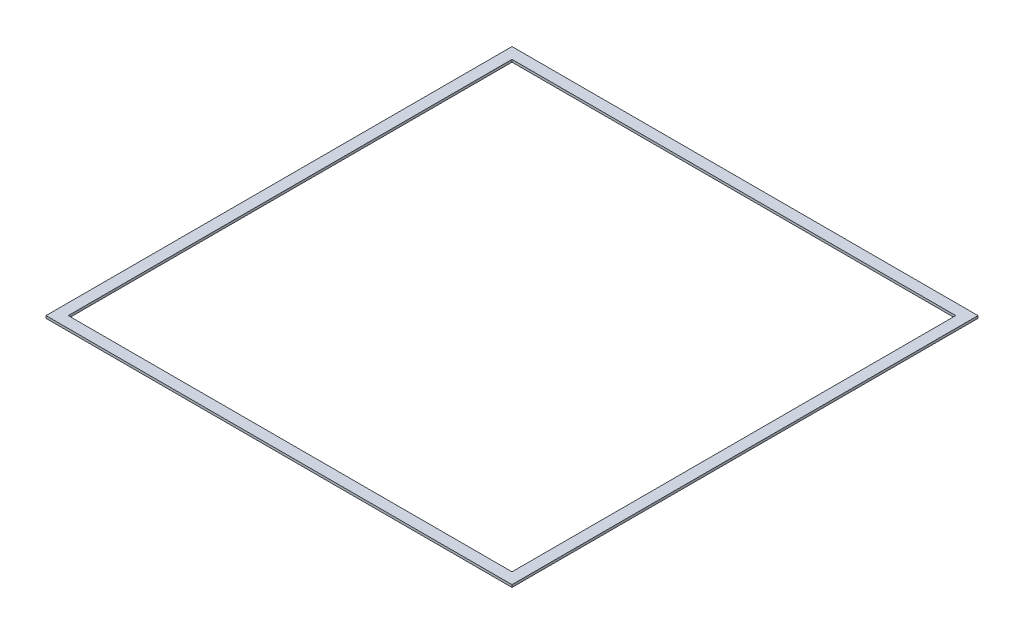
ISO-10303-21;
HEADER;
FILE_DESCRIPTION(('STEP AP214'),'2;1');
FILE_NAME('part.step','',(''),(''),'','','');
FILE_SCHEMA(('AUTOMOTIVE_DESIGN { 1 0 10303 214 1 1 1 1 }'));
ENDSEC;
DATA;
#1=APPLICATION_CONTEXT('core data for automotive mechanical design processes');
#2=APPLICATION_PROTOCOL_DEFINITION('international standard','automotive_design',2000,#1);
#3=PRODUCT_CONTEXT('',#1,'mechanical');
#4=PRODUCT('Part','Part','',(#3));
#5=PRODUCT_RELATED_PRODUCT_CATEGORY('part','',(#4));
#6=PRODUCT_DEFINITION_FORMATION('','',#4);
#7=PRODUCT_DEFINITION_CONTEXT('part definition',#1,'design');
#8=PRODUCT_DEFINITION('design','',#6,#7);
#9=PRODUCT_DEFINITION_SHAPE('','',#8);
#10=(LENGTH_UNIT() NAMED_UNIT(*) SI_UNIT(.MILLI.,.METRE.));
#11=(NAMED_UNIT(*) PLANE_ANGLE_UNIT() SI_UNIT($,.RADIAN.));
#12=(NAMED_UNIT(*) SI_UNIT($,.STERADIAN.) SOLID_ANGLE_UNIT());
#13=UNCERTAINTY_MEASURE_WITH_UNIT(LENGTH_MEASURE(1.E-05),#10,'distance_accuracy_value','');
#14=(GEOMETRIC_REPRESENTATION_CONTEXT(3) GLOBAL_UNCERTAINTY_ASSIGNED_CONTEXT((#13)) GLOBAL_UNIT_ASSIGNED_CONTEXT((#10,
#11,#12)) REPRESENTATION_CONTEXT('',''));
#15=CARTESIAN_POINT('',(0.,0.,0.));
#16=DIRECTION('',(0.,0.,1.));
#17=DIRECTION('',(1.,0.,0.));
#18=AXIS2_PLACEMENT_3D('',#15,#16,#17);
#19=CARTESIAN_POINT('',(0.,1.1,0.));
#20=DIRECTION('',(0.,1.,0.));
#21=DIRECTION('',(0.,0.,1.));
#22=AXIS2_PLACEMENT_3D('',#19,#20,#21);
#23=PLANE('',#22);
#24=DIRECTION('',(1.,0.,0.));
#25=VECTOR('',#24,1.);
#26=CARTESIAN_POINT('',(-209.5,1.1,209.5));
#27=LINE('',#26,#25);
#28=CARTESIAN_POINT('',(-209.5,1.1,209.5));
#29=VERTEX_POINT('',#28);
#30=CARTESIAN_POINT('',(209.5,1.1,209.5));
#31=VERTEX_POINT('',#30);
#32=EDGE_CURVE('E153',#29,#31,#27,.T.);
#33=ORIENTED_EDGE('',*,*,#32,.T.);
#34=DIRECTION('',(0.,0.,-1.));
#35=VECTOR('',#34,1.);
#36=CARTESIAN_POINT('',(209.5,1.1,209.5));
#37=LINE('',#36,#35);
#38=CARTESIAN_POINT('',(209.5,1.1,-209.5));
#39=VERTEX_POINT('',#38);
#40=EDGE_CURVE('E157',#31,#39,#37,.T.);
#41=ORIENTED_EDGE('',*,*,#40,.T.);
#42=DIRECTION('',(-1.,0.,0.));
#43=VECTOR('',#42,1.);
#44=CARTESIAN_POINT('',(-209.5,1.1,-209.5));
#45=LINE('',#44,#43);
#46=CARTESIAN_POINT('',(-209.5,1.1,-209.5));
#47=VERTEX_POINT('',#46);
#48=EDGE_CURVE('E161',#39,#47,#45,.T.);
#49=ORIENTED_EDGE('',*,*,#48,.T.);
#50=DIRECTION('',(0.,0.,1.));
#51=VECTOR('',#50,1.);
#52=CARTESIAN_POINT('',(-209.5,1.1,209.5));
#53=LINE('',#52,#51);
#54=EDGE_CURVE('E164',#47,#29,#53,.T.);
#55=ORIENTED_EDGE('',*,*,#54,.T.);
#56=EDGE_LOOP('',(#33,#41,#49,#55));
#57=FACE_BOUND('',#56,.T.);
#58=DIRECTION('',(-1.,0.,0.));
#59=VECTOR('',#58,1.);
#60=CARTESIAN_POINT('',(-199.5,1.1,-199.5));
#61=LINE('',#60,#59);
#62=CARTESIAN_POINT('',(199.5,1.1,-199.5));
#63=VERTEX_POINT('',#62);
#64=CARTESIAN_POINT('',(-199.5,1.1,-199.5));
#65=VERTEX_POINT('',#64);
#66=EDGE_CURVE('E114',#63,#65,#61,.T.);
#67=ORIENTED_EDGE('',*,*,#66,.F.);
#68=DIRECTION('',(0.,0.,-1.));
#69=VECTOR('',#68,1.);
#70=CARTESIAN_POINT('',(199.5,1.1,199.5));
#71=LINE('',#70,#69);
#72=CARTESIAN_POINT('',(199.5,1.1,199.5));
#73=VERTEX_POINT('',#72);
#74=EDGE_CURVE('E105',#73,#63,#71,.T.);
#75=ORIENTED_EDGE('',*,*,#74,.F.);
#76=DIRECTION('',(1.,0.,0.));
#77=VECTOR('',#76,1.);
#78=CARTESIAN_POINT('',(-199.5,1.1,199.5));
#79=LINE('',#78,#77);
#80=CARTESIAN_POINT('',(-199.5,1.1,199.5));
#81=VERTEX_POINT('',#80);
#82=EDGE_CURVE('E131',#81,#73,#79,.T.);
#83=ORIENTED_EDGE('',*,*,#82,.F.);
#84=DIRECTION('',(0.,0.,1.));
#85=VECTOR('',#84,1.);
#86=CARTESIAN_POINT('',(-199.5,1.1,199.5));
#87=LINE('',#86,#85);
#88=EDGE_CURVE('E127',#65,#81,#87,.T.);
#89=ORIENTED_EDGE('',*,*,#88,.F.);
#90=EDGE_LOOP('',(#67,#75,#83,#89));
#91=FACE_BOUND('',#90,.T.);
#92=ADVANCED_FACE('F39',(#57,#91),#23,.T.);
#93=CARTESIAN_POINT('',(0.,-1.1,0.));
#94=DIRECTION('',(0.,1.,0.));
#95=DIRECTION('',(0.,0.,1.));
#96=AXIS2_PLACEMENT_3D('',#93,#94,#95);
#97=PLANE('',#96);
#98=DIRECTION('',(1.,0.,0.));
#99=VECTOR('',#98,1.);
#100=CARTESIAN_POINT('',(-209.5,-1.1,209.5));
#101=LINE('',#100,#99);
#102=CARTESIAN_POINT('',(-209.5,-1.1,209.5));
#103=VERTEX_POINT('',#102);
#104=CARTESIAN_POINT('',(209.5,-1.1,209.5));
#105=VERTEX_POINT('',#104);
#106=EDGE_CURVE('E123',#103,#105,#101,.T.);
#107=ORIENTED_EDGE('',*,*,#106,.F.);
#108=DIRECTION('',(0.,0.,1.));
#109=VECTOR('',#108,1.);
#110=CARTESIAN_POINT('',(-209.5,-1.1,209.5));
#111=LINE('',#110,#109);
#112=CARTESIAN_POINT('',(-209.5,-1.1,-209.5));
#113=VERTEX_POINT('',#112);
#114=EDGE_CURVE('E158',#113,#103,#111,.T.);
#115=ORIENTED_EDGE('',*,*,#114,.F.);
#116=DIRECTION('',(-1.,0.,0.));
#117=VECTOR('',#116,1.);
#118=CARTESIAN_POINT('',(-209.5,-1.1,-209.5));
#119=LINE('',#118,#117);
#120=CARTESIAN_POINT('',(209.5,-1.1,-209.5));
#121=VERTEX_POINT('',#120);
#122=EDGE_CURVE('E174',#121,#113,#119,.T.);
#123=ORIENTED_EDGE('',*,*,#122,.F.);
#124=DIRECTION('',(0.,0.,-1.));
#125=VECTOR('',#124,1.);
#126=CARTESIAN_POINT('',(209.5,-1.1,209.5));
#127=LINE('',#126,#125);
#128=EDGE_CURVE('E171',#105,#121,#127,.T.);
#129=ORIENTED_EDGE('',*,*,#128,.F.);
#130=EDGE_LOOP('',(#107,#115,#123,#129));
#131=FACE_BOUND('',#130,.T.);
#132=DIRECTION('',(0.,0.,-1.));
#133=VECTOR('',#132,1.);
#134=CARTESIAN_POINT('',(199.5,-1.1,199.5));
#135=LINE('',#134,#133);
#136=CARTESIAN_POINT('',(199.5,-1.1,199.5));
#137=VERTEX_POINT('',#136);
#138=CARTESIAN_POINT('',(199.5,-1.1,-199.5));
#139=VERTEX_POINT('',#138);
#140=EDGE_CURVE('E63',#137,#139,#135,.T.);
#141=ORIENTED_EDGE('',*,*,#140,.T.);
#142=DIRECTION('',(-1.,0.,0.));
#143=VECTOR('',#142,1.);
#144=CARTESIAN_POINT('',(-199.5,-1.1,-199.5));
#145=LINE('',#144,#143);
#146=CARTESIAN_POINT('',(-199.5,-1.1,-199.5));
#147=VERTEX_POINT('',#146);
#148=EDGE_CURVE('E121',#139,#147,#145,.T.);
#149=ORIENTED_EDGE('',*,*,#148,.T.);
#150=DIRECTION('',(0.,0.,1.));
#151=VECTOR('',#150,1.);
#152=CARTESIAN_POINT('',(-199.5,-1.1,199.5));
#153=LINE('',#152,#151);
#154=CARTESIAN_POINT('',(-199.5,-1.1,199.5));
#155=VERTEX_POINT('',#154);
#156=EDGE_CURVE('E140',#147,#155,#153,.T.);
#157=ORIENTED_EDGE('',*,*,#156,.T.);
#158=DIRECTION('',(1.,0.,0.));
#159=VECTOR('',#158,1.);
#160=CARTESIAN_POINT('',(-199.5,-1.1,199.5));
#161=LINE('',#160,#159);
#162=EDGE_CURVE('E115',#155,#137,#161,.T.);
#163=ORIENTED_EDGE('',*,*,#162,.T.);
#164=EDGE_LOOP('',(#141,#149,#157,#163));
#165=FACE_BOUND('',#164,.T.);
#166=ADVANCED_FACE('F197',(#131,#165),#97,.F.);
#167=CARTESIAN_POINT('',(-209.5,1.1,209.5));
#168=DIRECTION('',(0.,0.,-1.));
#169=DIRECTION('',(-1.,0.,0.));
#170=AXIS2_PLACEMENT_3D('',#167,#168,#169);
#171=PLANE('',#170);
#172=ORIENTED_EDGE('',*,*,#106,.T.);
#173=DIRECTION('',(0.,-1.,0.));
#174=VECTOR('',#173,1.);
#175=CARTESIAN_POINT('',(209.5,1.1,209.5));
#176=LINE('',#175,#174);
#177=EDGE_CURVE('E11',#31,#105,#176,.T.);
#178=ORIENTED_EDGE('',*,*,#177,.F.);
#179=ORIENTED_EDGE('',*,*,#32,.F.);
#180=DIRECTION('',(0.,-1.,0.));
#181=VECTOR('',#180,1.);
#182=CARTESIAN_POINT('',(-209.5,1.1,209.5));
#183=LINE('',#182,#181);
#184=EDGE_CURVE('E167',#29,#103,#183,.T.);
#185=ORIENTED_EDGE('',*,*,#184,.T.);
#186=EDGE_LOOP('',(#172,#178,#179,#185));
#187=FACE_BOUND('',#186,.T.);
#188=ADVANCED_FACE('F41',(#187),#171,.F.);
#189=CARTESIAN_POINT('',(209.5,1.1,209.5));
#190=DIRECTION('',(-1.,0.,0.));
#191=DIRECTION('',(0.,0.,1.));
#192=AXIS2_PLACEMENT_3D('',#189,#190,#191);
#193=PLANE('',#192);
#194=ORIENTED_EDGE('',*,*,#128,.T.);
#195=DIRECTION('',(0.,-1.,0.));
#196=VECTOR('',#195,1.);
#197=CARTESIAN_POINT('',(209.5,1.1,-209.5));
#198=LINE('',#197,#196);
#199=EDGE_CURVE('E48',#39,#121,#198,.T.);
#200=ORIENTED_EDGE('',*,*,#199,.F.);
#201=ORIENTED_EDGE('',*,*,#40,.F.);
#202=ORIENTED_EDGE('',*,*,#177,.T.);
#203=EDGE_LOOP('',(#194,#200,#201,#202));
#204=FACE_BOUND('',#203,.T.);
#205=ADVANCED_FACE('F207',(#204),#193,.F.);
#206=CARTESIAN_POINT('',(-209.5,1.1,-209.5));
#207=DIRECTION('',(0.,0.,1.));
#208=DIRECTION('',(1.,0.,0.));
#209=AXIS2_PLACEMENT_3D('',#206,#207,#208);
#210=PLANE('',#209);
#211=ORIENTED_EDGE('',*,*,#122,.T.);
#212=DIRECTION('',(0.,-1.,0.));
#213=VECTOR('',#212,1.);
#214=CARTESIAN_POINT('',(-209.5,1.1,-209.5));
#215=LINE('',#214,#213);
#216=EDGE_CURVE('E182',#47,#113,#215,.T.);
#217=ORIENTED_EDGE('',*,*,#216,.F.);
#218=ORIENTED_EDGE('',*,*,#48,.F.);
#219=ORIENTED_EDGE('',*,*,#199,.T.);
#220=EDGE_LOOP('',(#211,#217,#218,#219));
#221=FACE_BOUND('',#220,.T.);
#222=ADVANCED_FACE('F191',(#221),#210,.F.);
#223=CARTESIAN_POINT('',(-209.5,1.1,209.5));
#224=DIRECTION('',(1.,0.,0.));
#225=DIRECTION('',(0.,0.,-1.));
#226=AXIS2_PLACEMENT_3D('',#223,#224,#225);
#227=PLANE('',#226);
#228=ORIENTED_EDGE('',*,*,#114,.T.);
#229=ORIENTED_EDGE('',*,*,#184,.F.);
#230=ORIENTED_EDGE('',*,*,#54,.F.);
#231=ORIENTED_EDGE('',*,*,#216,.T.);
#232=EDGE_LOOP('',(#228,#229,#230,#231));
#233=FACE_BOUND('',#232,.T.);
#234=ADVANCED_FACE('F201',(#233),#227,.F.);
#235=CARTESIAN_POINT('',(199.5,1.1,199.5));
#236=DIRECTION('',(-1.,0.,0.));
#237=DIRECTION('',(0.,0.,1.));
#238=AXIS2_PLACEMENT_3D('',#235,#236,#237);
#239=PLANE('',#238);
#240=ORIENTED_EDGE('',*,*,#140,.F.);
#241=DIRECTION('',(0.,-1.,0.));
#242=VECTOR('',#241,1.);
#243=CARTESIAN_POINT('',(199.5,1.1,199.5));
#244=LINE('',#243,#242);
#245=EDGE_CURVE('E109',#73,#137,#244,.T.);
#246=ORIENTED_EDGE('',*,*,#245,.F.);
#247=ORIENTED_EDGE('',*,*,#74,.T.);
#248=DIRECTION('',(0.,-1.,0.));
#249=VECTOR('',#248,1.);
#250=CARTESIAN_POINT('',(199.5,1.1,-199.5));
#251=LINE('',#250,#249);
#252=EDGE_CURVE('E108',#63,#139,#251,.T.);
#253=ORIENTED_EDGE('',*,*,#252,.T.);
#254=EDGE_LOOP('',(#240,#246,#247,#253));
#255=FACE_BOUND('',#254,.T.);
#256=ADVANCED_FACE('F107',(#255),#239,.T.);
#257=CARTESIAN_POINT('',(-199.5,1.1,-199.5));
#258=DIRECTION('',(0.,0.,1.));
#259=DIRECTION('',(1.,0.,0.));
#260=AXIS2_PLACEMENT_3D('',#257,#258,#259);
#261=PLANE('',#260);
#262=ORIENTED_EDGE('',*,*,#148,.F.);
#263=ORIENTED_EDGE('',*,*,#252,.F.);
#264=ORIENTED_EDGE('',*,*,#66,.T.);
#265=DIRECTION('',(0.,-1.,0.));
#266=VECTOR('',#265,1.);
#267=CARTESIAN_POINT('',(-199.5,1.1,-199.5));
#268=LINE('',#267,#266);
#269=EDGE_CURVE('E124',#65,#147,#268,.T.);
#270=ORIENTED_EDGE('',*,*,#269,.T.);
#271=EDGE_LOOP('',(#262,#263,#264,#270));
#272=FACE_BOUND('',#271,.T.);
#273=ADVANCED_FACE('F118',(#272),#261,.T.);
#274=CARTESIAN_POINT('',(-199.5,1.1,199.5));
#275=DIRECTION('',(1.,0.,0.));
#276=DIRECTION('',(0.,0.,-1.));
#277=AXIS2_PLACEMENT_3D('',#274,#275,#276);
#278=PLANE('',#277);
#279=ORIENTED_EDGE('',*,*,#156,.F.);
#280=ORIENTED_EDGE('',*,*,#269,.F.);
#281=ORIENTED_EDGE('',*,*,#88,.T.);
#282=DIRECTION('',(0.,-1.,0.));
#283=VECTOR('',#282,1.);
#284=CARTESIAN_POINT('',(-199.5,1.1,199.5));
#285=LINE('',#284,#283);
#286=EDGE_CURVE('E55',#81,#155,#285,.T.);
#287=ORIENTED_EDGE('',*,*,#286,.T.);
#288=EDGE_LOOP('',(#279,#280,#281,#287));
#289=FACE_BOUND('',#288,.T.);
#290=ADVANCED_FACE('F230',(#289),#278,.T.);
#291=CARTESIAN_POINT('',(-199.5,1.1,199.5));
#292=DIRECTION('',(0.,0.,-1.));
#293=DIRECTION('',(-1.,0.,0.));
#294=AXIS2_PLACEMENT_3D('',#291,#292,#293);
#295=PLANE('',#294);
#296=ORIENTED_EDGE('',*,*,#162,.F.);
#297=ORIENTED_EDGE('',*,*,#286,.F.);
#298=ORIENTED_EDGE('',*,*,#82,.T.);
#299=ORIENTED_EDGE('',*,*,#245,.T.);
#300=EDGE_LOOP('',(#296,#297,#298,#299));
#301=FACE_BOUND('',#300,.T.);
#302=ADVANCED_FACE('F234',(#301),#295,.T.);
#303=CLOSED_SHELL('',(#92,#166,#188,#205,#222,#234,#256,#273,#290,#302));
#304=MANIFOLD_SOLID_BREP('B2',#303);
#305=ADVANCED_BREP_SHAPE_REPRESENTATION('',(#18,#304),#14);
#306=SHAPE_DEFINITION_REPRESENTATION(#9,#305);
ENDSEC;
END-ISO-10303-21;
